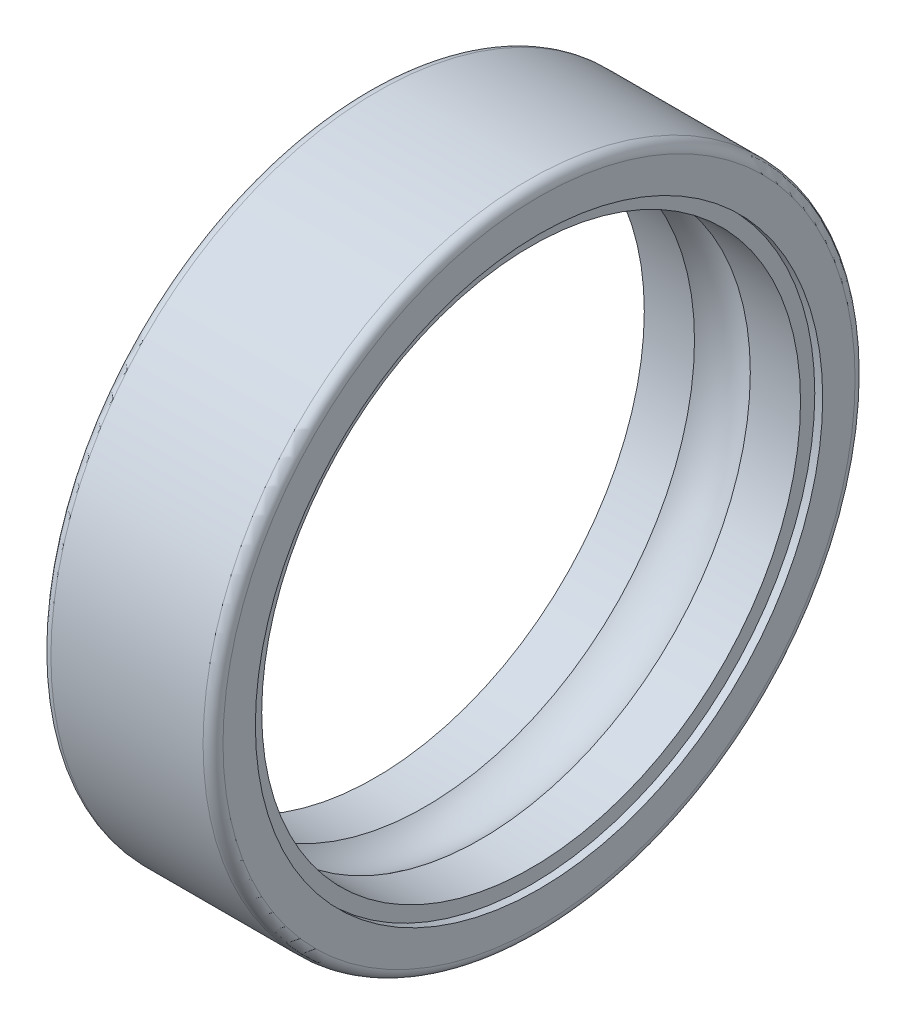
ISO-10303-21;
HEADER;
FILE_DESCRIPTION(('STEP AP214'),'2;1');
FILE_NAME('part.step','',(''),(''),'','','');
FILE_SCHEMA(('AUTOMOTIVE_DESIGN { 1 0 10303 214 1 1 1 1 }'));
ENDSEC;
DATA;
#1=APPLICATION_CONTEXT('core data for automotive mechanical design processes');
#2=APPLICATION_PROTOCOL_DEFINITION('international standard','automotive_design',2000,#1);
#3=PRODUCT_CONTEXT('',#1,'mechanical');
#4=PRODUCT('Part','Part','',(#3));
#5=PRODUCT_RELATED_PRODUCT_CATEGORY('part','',(#4));
#6=PRODUCT_DEFINITION_FORMATION('','',#4);
#7=PRODUCT_DEFINITION_CONTEXT('part definition',#1,'design');
#8=PRODUCT_DEFINITION('design','',#6,#7);
#9=PRODUCT_DEFINITION_SHAPE('','',#8);
#10=(LENGTH_UNIT() NAMED_UNIT(*) SI_UNIT(.MILLI.,.METRE.));
#11=(NAMED_UNIT(*) PLANE_ANGLE_UNIT() SI_UNIT($,.RADIAN.));
#12=(NAMED_UNIT(*) SI_UNIT($,.STERADIAN.) SOLID_ANGLE_UNIT());
#13=UNCERTAINTY_MEASURE_WITH_UNIT(LENGTH_MEASURE(1.E-05),#10,'distance_accuracy_value','');
#14=(GEOMETRIC_REPRESENTATION_CONTEXT(3) GLOBAL_UNCERTAINTY_ASSIGNED_CONTEXT((#13)) GLOBAL_UNIT_ASSIGNED_CONTEXT((#10,
#11,#12)) REPRESENTATION_CONTEXT('',''));
#15=CARTESIAN_POINT('',(0.,0.,0.));
#16=DIRECTION('',(0.,0.,1.));
#17=DIRECTION('',(1.,0.,0.));
#18=AXIS2_PLACEMENT_3D('',#15,#16,#17);
#19=CARTESIAN_POINT('',(0.,-35.2867073516444,-34.9));
#20=DIRECTION('',(-1.,0.,0.));
#21=DIRECTION('',(0.,0.,1.));
#22=AXIS2_PLACEMENT_3D('',#19,#20,#21);
#23=PLANE('',#22);
#24=CARTESIAN_POINT('',(0.,0.,0.));
#25=DIRECTION('',(-1.,0.,0.));
#26=DIRECTION('',(0.,0.,-1.));
#27=AXIS2_PLACEMENT_3D('',#24,#25,#26);
#28=CIRCLE('',#27,34.9);
#29=CARTESIAN_POINT('',(0.,0.,-34.9));
#30=VERTEX_POINT('',#29);
#31=EDGE_CURVE('E55',#30,#30,#28,.F.);
#32=ORIENTED_EDGE('',*,*,#31,.F.);
#33=EDGE_LOOP('',(#32));
#34=FACE_BOUND('',#33,.T.);
#35=CARTESIAN_POINT('',(0.,0.,0.));
#36=DIRECTION('',(1.,0.,0.));
#37=DIRECTION('',(0.,-1.16839197712111E-09,1.));
#38=AXIS2_PLACEMENT_3D('',#35,#36,#37);
#39=CIRCLE('',#38,31.325);
#40=CARTESIAN_POINT('',(0.,-3.65998786833188E-08,31.325));
#41=VERTEX_POINT('',#40);
#42=EDGE_CURVE('E52',#41,#41,#39,.T.);
#43=ORIENTED_EDGE('',*,*,#42,.T.);
#44=EDGE_LOOP('',(#43));
#45=FACE_BOUND('',#44,.T.);
#46=ADVANCED_FACE('F14',(#34,#45),#23,.T.);
#47=CARTESIAN_POINT('',(0.874,-31.6720947790906,-31.325));
#48=DIRECTION('',(-1.,0.,0.));
#49=DIRECTION('',(0.,0.,1.));
#50=AXIS2_PLACEMENT_3D('',#47,#48,#49);
#51=PLANE('',#50);
#52=CARTESIAN_POINT('',(0.874,0.,0.));
#53=DIRECTION('',(-1.,0.,0.));
#54=DIRECTION('',(0.,0.,-1.));
#55=AXIS2_PLACEMENT_3D('',#52,#53,#54);
#56=CIRCLE('',#55,31.325);
#57=CARTESIAN_POINT('',(0.874,0.,-31.325));
#58=VERTEX_POINT('',#57);
#59=EDGE_CURVE('E49',#58,#58,#56,.F.);
#60=ORIENTED_EDGE('',*,*,#59,.F.);
#61=EDGE_LOOP('',(#60));
#62=FACE_BOUND('',#61,.T.);
#63=CARTESIAN_POINT('',(0.874,0.,0.));
#64=DIRECTION('',(1.,0.,0.));
#65=DIRECTION('',(0.,-1.16854413353845E-09,1.));
#66=AXIS2_PLACEMENT_3D('',#63,#64,#65);
#67=CIRCLE('',#66,29.75);
#68=CARTESIAN_POINT('',(0.874,-3.47641879727689E-08,29.75));
#69=VERTEX_POINT('',#68);
#70=EDGE_CURVE('E46',#69,#69,#67,.T.);
#71=ORIENTED_EDGE('',*,*,#70,.T.);
#72=EDGE_LOOP('',(#71));
#73=FACE_BOUND('',#72,.T.);
#74=ADVANCED_FACE('F63',(#62,#73),#51,.T.);
#75=CARTESIAN_POINT('',(18.126,-31.6720947286791,31.325));
#76=DIRECTION('',(1.,0.,0.));
#77=DIRECTION('',(0.,0.,-1.));
#78=AXIS2_PLACEMENT_3D('',#75,#76,#77);
#79=PLANE('',#78);
#80=CARTESIAN_POINT('',(18.126,0.,0.));
#81=DIRECTION('',(1.,0.,0.));
#82=DIRECTION('',(0.,-1.16839175029183E-09,1.));
#83=AXIS2_PLACEMENT_3D('',#80,#81,#82);
#84=CIRCLE('',#83,31.325);
#85=CARTESIAN_POINT('',(18.126,-3.65998715778915E-08,31.325));
#86=VERTEX_POINT('',#85);
#87=EDGE_CURVE('E43',#86,#86,#84,.T.);
#88=ORIENTED_EDGE('',*,*,#87,.T.);
#89=EDGE_LOOP('',(#88));
#90=FACE_BOUND('',#89,.T.);
#91=CARTESIAN_POINT('',(18.126,0.,0.));
#92=DIRECTION('',(-1.,0.,0.));
#93=DIRECTION('',(0.,0.,-1.));
#94=AXIS2_PLACEMENT_3D('',#91,#92,#93);
#95=CIRCLE('',#94,29.75);
#96=CARTESIAN_POINT('',(18.126,0.,-29.75));
#97=VERTEX_POINT('',#96);
#98=EDGE_CURVE('E40',#97,#97,#95,.F.);
#99=ORIENTED_EDGE('',*,*,#98,.F.);
#100=EDGE_LOOP('',(#99));
#101=FACE_BOUND('',#100,.T.);
#102=ADVANCED_FACE('F81',(#90,#101),#79,.T.);
#103=CARTESIAN_POINT('',(19.,-35.2867073516444,34.9));
#104=DIRECTION('',(1.,0.,0.));
#105=DIRECTION('',(0.,0.,-1.));
#106=AXIS2_PLACEMENT_3D('',#103,#104,#105);
#107=PLANE('',#106);
#108=CARTESIAN_POINT('',(19.,0.,0.));
#109=DIRECTION('',(1.,0.,0.));
#110=DIRECTION('',(0.,0.,1.));
#111=AXIS2_PLACEMENT_3D('',#108,#109,#110);
#112=CIRCLE('',#111,34.9);
#113=CARTESIAN_POINT('',(19.,0.,34.9));
#114=VERTEX_POINT('',#113);
#115=EDGE_CURVE('E37',#114,#114,#112,.T.);
#116=ORIENTED_EDGE('',*,*,#115,.T.);
#117=EDGE_LOOP('',(#116));
#118=FACE_BOUND('',#117,.T.);
#119=CARTESIAN_POINT('',(19.,0.,0.));
#120=DIRECTION('',(-1.,0.,0.));
#121=DIRECTION('',(0.,0.,-1.));
#122=AXIS2_PLACEMENT_3D('',#119,#120,#121);
#123=CIRCLE('',#122,31.325);
#124=CARTESIAN_POINT('',(19.,0.,-31.325));
#125=VERTEX_POINT('',#124);
#126=EDGE_CURVE('E34',#125,#125,#123,.F.);
#127=ORIENTED_EDGE('',*,*,#126,.F.);
#128=EDGE_LOOP('',(#127));
#129=FACE_BOUND('',#128,.T.);
#130=ADVANCED_FACE('F70',(#118,#129),#107,.T.);
#131=CARTESIAN_POINT('',(19.,0.,0.));
#132=DIRECTION('',(1.,0.,0.));
#133=DIRECTION('',(0.,0.,1.));
#134=AXIS2_PLACEMENT_3D('',#131,#132,#133);
#135=CYLINDRICAL_SURFACE('',#134,31.325);
#136=ORIENTED_EDGE('',*,*,#59,.T.);
#137=EDGE_LOOP('',(#136));
#138=FACE_BOUND('',#137,.T.);
#139=ORIENTED_EDGE('',*,*,#42,.F.);
#140=EDGE_LOOP('',(#139));
#141=FACE_BOUND('',#140,.T.);
#142=ADVANCED_FACE('F67',(#138,#141),#135,.F.);
#143=CARTESIAN_POINT('',(19.,0.,0.));
#144=DIRECTION('',(1.,0.,0.));
#145=DIRECTION('',(0.,0.,1.));
#146=AXIS2_PLACEMENT_3D('',#143,#144,#145);
#147=CYLINDRICAL_SURFACE('',#146,29.75);
#148=CARTESIAN_POINT('',(6.4177929985155,0.,0.));
#149=DIRECTION('',(1.,0.,0.));
#150=DIRECTION('',(0.,0.,1.));
#151=AXIS2_PLACEMENT_3D('',#148,#149,#150);
#152=CIRCLE('',#151,29.75);
#153=CARTESIAN_POINT('',(6.4177929985155,0.,29.75));
#154=VERTEX_POINT('',#153);
#155=EDGE_CURVE('E29',#154,#154,#152,.T.);
#156=ORIENTED_EDGE('',*,*,#155,.T.);
#157=EDGE_LOOP('',(#156));
#158=FACE_BOUND('',#157,.T.);
#159=ORIENTED_EDGE('',*,*,#70,.F.);
#160=EDGE_LOOP('',(#159));
#161=FACE_BOUND('',#160,.T.);
#162=ADVANCED_FACE('F69',(#158,#161),#147,.F.);
#163=CARTESIAN_POINT('',(9.49999999999975,0.,0.));
#164=DIRECTION('',(1.,0.,0.));
#165=DIRECTION('',(0.,0.,1.));
#166=AXIS2_PLACEMENT_3D('',#163,#164,#165);
#167=TOROIDAL_SURFACE('',#166,25.5000000000007,5.24999999999928);
#168=ORIENTED_EDGE('',*,*,#155,.F.);
#169=EDGE_LOOP('',(#168));
#170=FACE_BOUND('',#169,.T.);
#171=CARTESIAN_POINT('',(12.582207001484,0.,0.));
#172=DIRECTION('',(1.,0.,0.));
#173=DIRECTION('',(0.,-1.92339355213481E-10,1.));
#174=AXIS2_PLACEMENT_3D('',#171,#172,#173);
#175=CIRCLE('',#174,29.75);
#176=CARTESIAN_POINT('',(12.582207001484,-5.72209581760105E-09,29.75));
#177=VERTEX_POINT('',#176);
#178=EDGE_CURVE('E25',#177,#177,#175,.T.);
#179=ORIENTED_EDGE('',*,*,#178,.T.);
#180=EDGE_LOOP('',(#179));
#181=FACE_BOUND('',#180,.T.);
#182=ADVANCED_FACE('F78',(#170,#181),#167,.F.);
#183=CARTESIAN_POINT('',(19.,0.,0.));
#184=DIRECTION('',(1.,0.,0.));
#185=DIRECTION('',(0.,1.16854405075182E-09,1.));
#186=AXIS2_PLACEMENT_3D('',#183,#184,#185);
#187=CYLINDRICAL_SURFACE('',#186,29.75);
#188=ORIENTED_EDGE('',*,*,#98,.T.);
#189=EDGE_LOOP('',(#188));
#190=FACE_BOUND('',#189,.T.);
#191=ORIENTED_EDGE('',*,*,#178,.F.);
#192=EDGE_LOOP('',(#191));
#193=FACE_BOUND('',#192,.T.);
#194=ADVANCED_FACE('F88',(#190,#193),#187,.F.);
#195=CARTESIAN_POINT('',(19.,0.,0.));
#196=DIRECTION('',(1.,0.,0.));
#197=DIRECTION('',(0.,0.,1.));
#198=AXIS2_PLACEMENT_3D('',#195,#196,#197);
#199=CYLINDRICAL_SURFACE('',#198,31.325);
#200=ORIENTED_EDGE('',*,*,#126,.T.);
#201=EDGE_LOOP('',(#200));
#202=FACE_BOUND('',#201,.T.);
#203=ORIENTED_EDGE('',*,*,#87,.F.);
#204=EDGE_LOOP('',(#203));
#205=FACE_BOUND('',#204,.T.);
#206=ADVANCED_FACE('F92',(#202,#205),#199,.F.);
#207=CARTESIAN_POINT('',(17.8999999999993,0.,0.));
#208=DIRECTION('',(1.,0.,0.));
#209=DIRECTION('',(0.,0.,1.));
#210=AXIS2_PLACEMENT_3D('',#207,#208,#209);
#211=TOROIDAL_SURFACE('',#210,34.8999999999993,1.1000000000007);
#212=CARTESIAN_POINT('',(17.8999999999993,0.,0.));
#213=DIRECTION('',(1.,0.,0.));
#214=DIRECTION('',(0.,0.,1.));
#215=AXIS2_PLACEMENT_3D('',#212,#213,#214);
#216=CIRCLE('',#215,36.);
#217=CARTESIAN_POINT('',(17.8999999999993,0.,36.));
#218=VERTEX_POINT('',#217);
#219=EDGE_CURVE('E21',#218,#218,#216,.T.);
#220=ORIENTED_EDGE('',*,*,#219,.T.);
#221=EDGE_LOOP('',(#220));
#222=FACE_BOUND('',#221,.T.);
#223=ORIENTED_EDGE('',*,*,#115,.F.);
#224=EDGE_LOOP('',(#223));
#225=FACE_BOUND('',#224,.T.);
#226=ADVANCED_FACE('F96',(#222,#225),#211,.T.);
#227=CARTESIAN_POINT('',(19.,0.,0.));
#228=DIRECTION('',(1.,0.,0.));
#229=DIRECTION('',(0.,0.,1.));
#230=AXIS2_PLACEMENT_3D('',#227,#228,#229);
#231=CYLINDRICAL_SURFACE('',#230,36.);
#232=CARTESIAN_POINT('',(1.1,0.,0.));
#233=DIRECTION('',(1.,0.,0.));
#234=DIRECTION('',(0.,0.,1.));
#235=AXIS2_PLACEMENT_3D('',#232,#233,#234);
#236=CIRCLE('',#235,36.);
#237=CARTESIAN_POINT('',(1.1,0.,36.));
#238=VERTEX_POINT('',#237);
#239=EDGE_CURVE('E10',#238,#238,#236,.T.);
#240=ORIENTED_EDGE('',*,*,#239,.T.);
#241=EDGE_LOOP('',(#240));
#242=FACE_BOUND('',#241,.T.);
#243=ORIENTED_EDGE('',*,*,#219,.F.);
#244=EDGE_LOOP('',(#243));
#245=FACE_BOUND('',#244,.T.);
#246=ADVANCED_FACE('F99',(#242,#245),#231,.T.);
#247=CARTESIAN_POINT('',(1.10000000000036,0.,0.));
#248=DIRECTION('',(1.,0.,0.));
#249=DIRECTION('',(0.,0.,1.));
#250=AXIS2_PLACEMENT_3D('',#247,#248,#249);
#251=TOROIDAL_SURFACE('',#250,34.8999999999996,1.10000000000036);
#252=ORIENTED_EDGE('',*,*,#31,.T.);
#253=EDGE_LOOP('',(#252));
#254=FACE_BOUND('',#253,.T.);
#255=ORIENTED_EDGE('',*,*,#239,.F.);
#256=EDGE_LOOP('',(#255));
#257=FACE_BOUND('',#256,.T.);
#258=ADVANCED_FACE('F16',(#254,#257),#251,.T.);
#259=CLOSED_SHELL('',(#46,#74,#102,#130,#142,#162,#182,#194,#206,#226,#246,#258));
#260=MANIFOLD_SOLID_BREP('B1',#259);
#261=ADVANCED_BREP_SHAPE_REPRESENTATION('',(#18,#260),#14);
#262=SHAPE_DEFINITION_REPRESENTATION(#9,#261);
ENDSEC;
END-ISO-10303-21;
